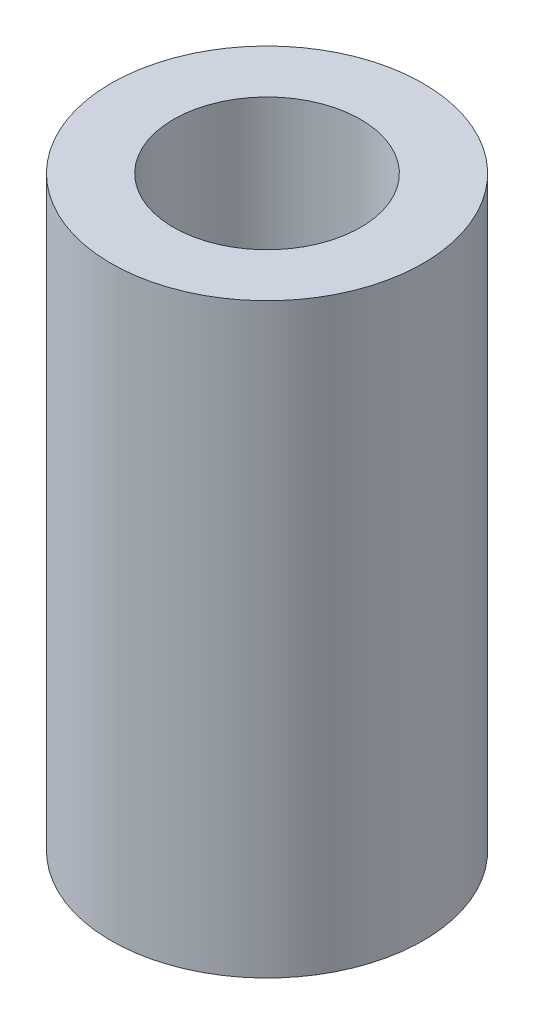
ISO-10303-21;
HEADER;
FILE_DESCRIPTION(('STEP AP214'),'2;1');
FILE_NAME('part.step','',(''),(''),'','','');
FILE_SCHEMA(('AUTOMOTIVE_DESIGN { 1 0 10303 214 1 1 1 1 }'));
ENDSEC;
DATA;
#1=APPLICATION_CONTEXT('core data for automotive mechanical design processes');
#2=APPLICATION_PROTOCOL_DEFINITION('international standard','automotive_design',2000,#1);
#3=PRODUCT_CONTEXT('',#1,'mechanical');
#4=PRODUCT('Part','Part','',(#3));
#5=PRODUCT_RELATED_PRODUCT_CATEGORY('part','',(#4));
#6=PRODUCT_DEFINITION_FORMATION('','',#4);
#7=PRODUCT_DEFINITION_CONTEXT('part definition',#1,'design');
#8=PRODUCT_DEFINITION('design','',#6,#7);
#9=PRODUCT_DEFINITION_SHAPE('','',#8);
#10=(LENGTH_UNIT() NAMED_UNIT(*) SI_UNIT(.MILLI.,.METRE.));
#11=(NAMED_UNIT(*) PLANE_ANGLE_UNIT() SI_UNIT($,.RADIAN.));
#12=(NAMED_UNIT(*) SI_UNIT($,.STERADIAN.) SOLID_ANGLE_UNIT());
#13=UNCERTAINTY_MEASURE_WITH_UNIT(LENGTH_MEASURE(1.E-05),#10,'distance_accuracy_value','');
#14=(GEOMETRIC_REPRESENTATION_CONTEXT(3) GLOBAL_UNCERTAINTY_ASSIGNED_CONTEXT((#13)) GLOBAL_UNIT_ASSIGNED_CONTEXT((#10,
#11,#12)) REPRESENTATION_CONTEXT('',''));
#15=CARTESIAN_POINT('',(0.,0.,0.));
#16=DIRECTION('',(0.,0.,1.));
#17=DIRECTION('',(1.,0.,0.));
#18=AXIS2_PLACEMENT_3D('',#15,#16,#17);
#19=CARTESIAN_POINT('',(109.311327128389,0.,13.7666521007557));
#20=DIRECTION('',(0.,1.,0.));
#21=DIRECTION('',(1.,0.,0.));
#22=AXIS2_PLACEMENT_3D('',#19,#20,#21);
#23=PLANE('',#22);
#24=CARTESIAN_POINT('',(109.311327128389,0.,13.7666521007557));
#25=DIRECTION('',(0.,-1.,0.));
#26=DIRECTION('',(1.,0.,0.));
#27=AXIS2_PLACEMENT_3D('',#24,#25,#26);
#28=CIRCLE('',#27,1.5);
#29=CARTESIAN_POINT('',(107.811327128389,0.,13.7666521007557));
#30=VERTEX_POINT('',#29);
#31=EDGE_CURVE('E53',#30,#30,#28,.T.);
#32=ORIENTED_EDGE('',*,*,#31,.F.);
#33=EDGE_LOOP('',(#32));
#34=FACE_BOUND('',#33,.T.);
#35=CARTESIAN_POINT('',(109.311327128389,0.,13.7666521007557));
#36=DIRECTION('',(0.,1.,0.));
#37=DIRECTION('',(1.,0.,0.));
#38=AXIS2_PLACEMENT_3D('',#35,#36,#37);
#39=CIRCLE('',#38,2.5);
#40=CARTESIAN_POINT('',(106.811327128389,0.,13.7666521007557));
#41=VERTEX_POINT('',#40);
#42=EDGE_CURVE('E11',#41,#41,#39,.T.);
#43=ORIENTED_EDGE('',*,*,#42,.F.);
#44=EDGE_LOOP('',(#43));
#45=FACE_BOUND('',#44,.T.);
#46=ADVANCED_FACE('F16',(#34,#45),#23,.F.);
#47=CARTESIAN_POINT('',(109.311327128389,9.4,13.7666521007557));
#48=DIRECTION('',(0.,1.,0.));
#49=DIRECTION('',(1.,0.,0.));
#50=AXIS2_PLACEMENT_3D('',#47,#48,#49);
#51=PLANE('',#50);
#52=CARTESIAN_POINT('',(109.311327128389,9.4,13.7666521007557));
#53=DIRECTION('',(0.,-1.,0.));
#54=DIRECTION('',(1.,0.,0.));
#55=AXIS2_PLACEMENT_3D('',#52,#53,#54);
#56=CIRCLE('',#55,1.5);
#57=CARTESIAN_POINT('',(107.811327128389,9.4,13.7666521007557));
#58=VERTEX_POINT('',#57);
#59=EDGE_CURVE('E65',#58,#58,#56,.T.);
#60=ORIENTED_EDGE('',*,*,#59,.T.);
#61=EDGE_LOOP('',(#60));
#62=FACE_BOUND('',#61,.T.);
#63=CARTESIAN_POINT('',(109.311327128389,9.4,13.7666521007557));
#64=DIRECTION('',(0.,1.,0.));
#65=DIRECTION('',(1.,0.,0.));
#66=AXIS2_PLACEMENT_3D('',#63,#64,#65);
#67=CIRCLE('',#66,2.5);
#68=CARTESIAN_POINT('',(106.811327128389,9.4,13.7666521007557));
#69=VERTEX_POINT('',#68);
#70=EDGE_CURVE('E57',#69,#69,#67,.T.);
#71=ORIENTED_EDGE('',*,*,#70,.T.);
#72=EDGE_LOOP('',(#71));
#73=FACE_BOUND('',#72,.T.);
#74=ADVANCED_FACE('F18',(#62,#73),#51,.T.);
#75=CARTESIAN_POINT('',(109.311327128389,0.,13.7666521007557));
#76=DIRECTION('',(0.,1.,0.));
#77=DIRECTION('',(1.,0.,0.));
#78=AXIS2_PLACEMENT_3D('',#75,#76,#77);
#79=CYLINDRICAL_SURFACE('',#78,2.5);
#80=ORIENTED_EDGE('',*,*,#70,.F.);
#81=DIRECTION('',(0.,-1.,0.));
#82=VECTOR('',#81,1.);
#83=CARTESIAN_POINT('',(106.811327128389,0.,13.7666521007557));
#84=LINE('',#83,#82);
#85=EDGE_CURVE('E20',#69,#41,#84,.T.);
#86=ORIENTED_EDGE('',*,*,#85,.T.);
#87=ORIENTED_EDGE('',*,*,#42,.T.);
#88=ORIENTED_EDGE('',*,*,#85,.F.);
#89=EDGE_LOOP('',(#80,#86,#87,#88));
#90=FACE_BOUND('',#89,.T.);
#91=ADVANCED_FACE('F74',(#90),#79,.T.);
#92=CARTESIAN_POINT('',(109.311327128389,0.,13.7666521007557));
#93=DIRECTION('',(0.,1.,0.));
#94=DIRECTION('',(1.,0.,0.));
#95=AXIS2_PLACEMENT_3D('',#92,#93,#94);
#96=CYLINDRICAL_SURFACE('',#95,1.5);
#97=ORIENTED_EDGE('',*,*,#59,.F.);
#98=DIRECTION('',(0.,-1.,0.));
#99=VECTOR('',#98,1.);
#100=CARTESIAN_POINT('',(107.811327128389,0.,13.7666521007557));
#101=LINE('',#100,#99);
#102=EDGE_CURVE('E48',#58,#30,#101,.T.);
#103=ORIENTED_EDGE('',*,*,#102,.T.);
#104=ORIENTED_EDGE('',*,*,#31,.T.);
#105=ORIENTED_EDGE('',*,*,#102,.F.);
#106=EDGE_LOOP('',(#97,#103,#104,#105));
#107=FACE_BOUND('',#106,.T.);
#108=ADVANCED_FACE('F54',(#107),#96,.F.);
#109=CLOSED_SHELL('',(#46,#74,#91,#108));
#110=MANIFOLD_SOLID_BREP('B1',#109);
#111=ADVANCED_BREP_SHAPE_REPRESENTATION('',(#18,#110),#14);
#112=SHAPE_DEFINITION_REPRESENTATION(#9,#111);
ENDSEC;
END-ISO-10303-21;
